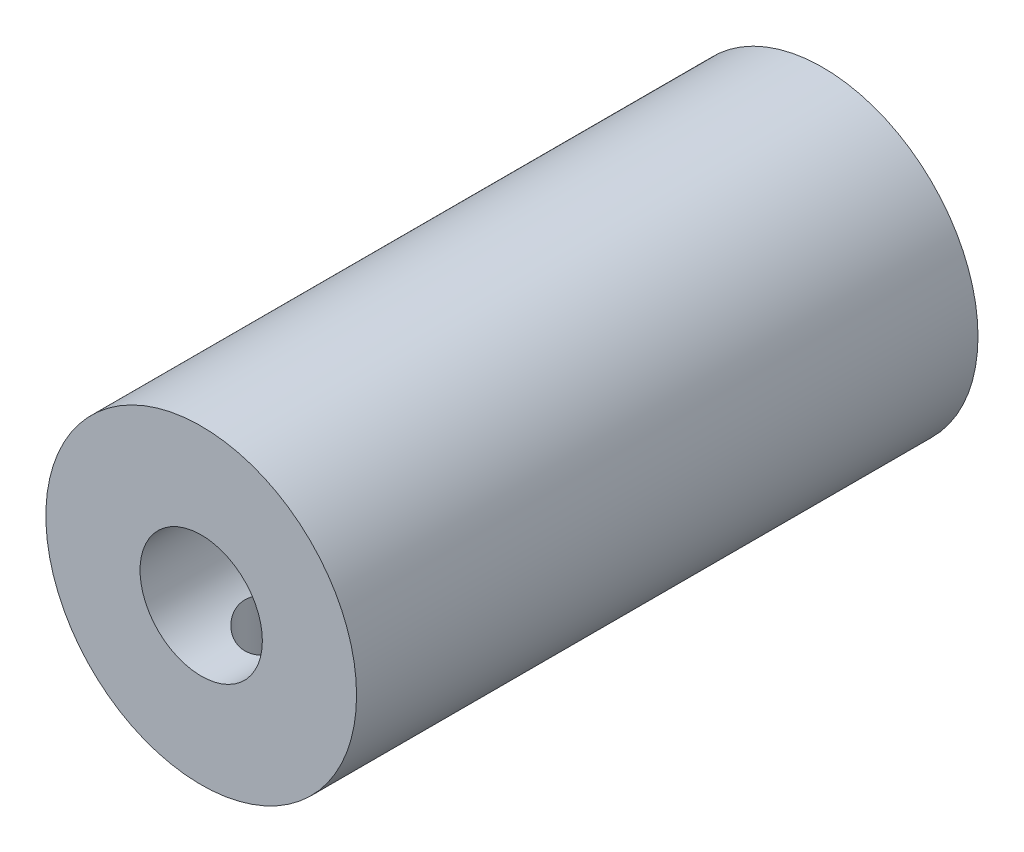
ISO-10303-21;
HEADER;
FILE_DESCRIPTION(('STEP AP214'),'2;1');
FILE_NAME('part.step','',(''),(''),'','','');
FILE_SCHEMA(('AUTOMOTIVE_DESIGN { 1 0 10303 214 1 1 1 1 }'));
ENDSEC;
DATA;
#1=APPLICATION_CONTEXT('core data for automotive mechanical design processes');
#2=APPLICATION_PROTOCOL_DEFINITION('international standard','automotive_design',2000,#1);
#3=PRODUCT_CONTEXT('',#1,'mechanical');
#4=PRODUCT('Part','Part','',(#3));
#5=PRODUCT_RELATED_PRODUCT_CATEGORY('part','',(#4));
#6=PRODUCT_DEFINITION_FORMATION('','',#4);
#7=PRODUCT_DEFINITION_CONTEXT('part definition',#1,'design');
#8=PRODUCT_DEFINITION('design','',#6,#7);
#9=PRODUCT_DEFINITION_SHAPE('','',#8);
#10=(LENGTH_UNIT() NAMED_UNIT(*) SI_UNIT(.MILLI.,.METRE.));
#11=(NAMED_UNIT(*) PLANE_ANGLE_UNIT() SI_UNIT($,.RADIAN.));
#12=(NAMED_UNIT(*) SI_UNIT($,.STERADIAN.) SOLID_ANGLE_UNIT());
#13=UNCERTAINTY_MEASURE_WITH_UNIT(LENGTH_MEASURE(1.E-05),#10,'distance_accuracy_value','');
#14=(GEOMETRIC_REPRESENTATION_CONTEXT(3) GLOBAL_UNCERTAINTY_ASSIGNED_CONTEXT((#13)) GLOBAL_UNIT_ASSIGNED_CONTEXT((#10,
#11,#12)) REPRESENTATION_CONTEXT('',''));
#15=CARTESIAN_POINT('',(0.,0.,0.));
#16=DIRECTION('',(0.,0.,1.));
#17=DIRECTION('',(1.,0.,0.));
#18=AXIS2_PLACEMENT_3D('',#15,#16,#17);
#19=CARTESIAN_POINT('',(0.,0.,25.4));
#20=DIRECTION('',(0.,0.,-1.));
#21=DIRECTION('',(-1.,0.,0.));
#22=AXIS2_PLACEMENT_3D('',#19,#20,#21);
#23=CYLINDRICAL_SURFACE('',#22,6.35);
#24=CARTESIAN_POINT('',(0.,-6.35,23.6140625));
#25=CARTESIAN_POINT('',(-0.0770408471682805,-6.34999857899858,23.6140598693034));
#26=CARTESIAN_POINT('',(-0.15411348315526,-6.34858371582944,23.6076315480876));
#27=CARTESIAN_POINT('',(-0.306069518531246,-6.3430762080525,23.5821148143666));
#28=CARTESIAN_POINT('',(-0.380951313826294,-6.33898165026606,23.5630173565476));
#29=CARTESIAN_POINT('',(-0.526307623730002,-6.32857064766496,23.5127891374238));
#30=CARTESIAN_POINT('',(-0.596786653438423,-6.32225652460999,23.4816709469655));
#31=CARTESIAN_POINT('',(-0.731520840225308,-6.30808785716228,23.4083244870091));
#32=CARTESIAN_POINT('',(-0.795776158099902,-6.30023335258277,23.3660965046489));
#33=CARTESIAN_POINT('',(-0.917272723348732,-6.28370341003478,23.2710119171915));
#34=CARTESIAN_POINT('',(-0.974399782936218,-6.27501778865132,23.218011163738));
#35=CARTESIAN_POINT('',(-1.07902809540525,-6.25787628862363,23.1031949885077));
#36=CARTESIAN_POINT('',(-1.12652848987194,-6.24942043052567,23.0413787814889));
#37=CARTESIAN_POINT('',(-1.21105894182183,-6.23359544573771,22.9098421298178));
#38=CARTESIAN_POINT('',(-1.24796743339354,-6.22623936751427,22.8400418522263));
#39=CARTESIAN_POINT('',(-1.30948659380819,-6.21359298291537,22.6950422066535));
#40=CARTESIAN_POINT('',(-1.33409873341495,-6.20830242949952,22.61984348561));
#41=CARTESIAN_POINT('',(-1.36994915689751,-6.20048981569181,22.467420223313));
#42=CARTESIAN_POINT('',(-1.38138961213298,-6.19792595162784,22.3902454219172));
#43=CARTESIAN_POINT('',(-1.39120053912365,-6.19573145355588,22.2350325548732));
#44=CARTESIAN_POINT('',(-1.3895726177385,-6.19610045892848,22.1569945965354));
#45=CARTESIAN_POINT('',(-1.37345569747506,-6.19969216119694,22.0037736715116));
#46=CARTESIAN_POINT('',(-1.35920156493733,-6.20286274198083,21.9285645930165));
#47=CARTESIAN_POINT('',(-1.31860894659745,-6.21161795094662,21.7816317978724));
#48=CARTESIAN_POINT('',(-1.29226978268468,-6.21720271459119,21.7099082770534));
#49=CARTESIAN_POINT('',(-1.22803912268214,-6.23020838169099,21.5713223209075));
#50=CARTESIAN_POINT('',(-1.19005732002183,-6.23764354992541,21.5045031345282));
#51=CARTESIAN_POINT('',(-1.10368304558917,-6.25350352055307,21.3780997711631));
#52=CARTESIAN_POINT('',(-1.05528915442123,-6.26192845780233,21.3185165823363));
#53=CARTESIAN_POINT('',(-0.948221191319583,-6.27904229219529,21.2069243751887));
#54=CARTESIAN_POINT('',(-0.889347407317585,-6.28773295721028,21.1551070541177));
#55=CARTESIAN_POINT('',(-0.763647218737204,-6.30423308338503,21.062050075938));
#56=CARTESIAN_POINT('',(-0.69682067007699,-6.31204252857457,21.0208106105132));
#57=CARTESIAN_POINT('',(-0.556877893735644,-6.32592565886696,20.9500325873793));
#58=CARTESIAN_POINT('',(-0.483748565062281,-6.33199560926044,20.9205191538667));
#59=CARTESIAN_POINT('',(-0.333406298546851,-6.3416880672381,20.8742527118445));
#60=CARTESIAN_POINT('',(-0.256193956405841,-6.34531093078939,20.8574978473559));
#61=CARTESIAN_POINT('',(-0.101521759768154,-6.34965034804132,20.8375029862832));
#62=CARTESIAN_POINT('',(-0.0240972914376585,-6.35042320588568,20.8340011288717));
#63=CARTESIAN_POINT('',(0.130230356866134,-6.34913331284916,20.8399019189039));
#64=CARTESIAN_POINT('',(0.20713357184841,-6.34707075433855,20.8493036908942));
#65=CARTESIAN_POINT('',(0.357368057618589,-6.34037731419124,20.8805277277516));
#66=CARTESIAN_POINT('',(0.43072925302515,-6.33577484832666,20.9022126419359));
#67=CARTESIAN_POINT('',(0.572772984759522,-6.32451674628277,20.9572349508315));
#68=CARTESIAN_POINT('',(0.641455121837127,-6.31786093516479,20.9905733384149));
#69=CARTESIAN_POINT('',(0.773273856447656,-6.30309556357787,21.0685018158413));
#70=CARTESIAN_POINT('',(0.836317293289703,-6.29496660673028,21.1132457334331));
#71=CARTESIAN_POINT('',(0.954094899266633,-6.27819624848666,21.2125125908739));
#72=CARTESIAN_POINT('',(1.00882798728205,-6.26955478061946,21.2670368010628));
#73=CARTESIAN_POINT('',(1.10946652714324,-6.2525388718201,21.3855181122511));
#74=CARTESIAN_POINT('',(1.15519065365343,-6.24417228961642,21.4496305695928));
#75=CARTESIAN_POINT('',(1.23522363853578,-6.22883534751375,21.5847783780868));
#76=CARTESIAN_POINT('',(1.26953299083004,-6.22186492720743,21.6558134295235));
#77=CARTESIAN_POINT('',(1.3255308249353,-6.21017608603567,21.8024091155417));
#78=CARTESIAN_POINT('',(1.34729026638093,-6.2054450311924,21.8779415872971));
#79=CARTESIAN_POINT('',(1.3777784494499,-6.19874782905592,22.0317075911832));
#80=CARTESIAN_POINT('',(1.38650927531006,-6.19678123952368,22.1099406892354));
#81=CARTESIAN_POINT('',(1.3906036744485,-6.19586350318036,22.2650589152149));
#82=CARTESIAN_POINT('',(1.38625475155462,-6.1968474986074,22.3419362101337));
#83=CARTESIAN_POINT('',(1.36495585245806,-6.20157337782062,22.4938340945831));
#84=CARTESIAN_POINT('',(1.34800602480797,-6.20531522909432,22.5688547059914));
#85=CARTESIAN_POINT('',(1.30212537285487,-6.21510358904485,22.7146812276129));
#86=CARTESIAN_POINT('',(1.27323639800581,-6.22114204176945,22.7855008812921));
#87=CARTESIAN_POINT('',(1.20433345118798,-6.23484638338867,22.9213309126718));
#88=CARTESIAN_POINT('',(1.16431831990124,-6.24251244185608,22.9863406840637));
#89=CARTESIAN_POINT('',(1.07334538224577,-6.25880195994543,23.1101228078034));
#90=CARTESIAN_POINT('',(1.0221826878529,-6.2674416430782,23.1687424725145));
#91=CARTESIAN_POINT('',(0.910782131259336,-6.28459592080665,23.2766586209977));
#92=CARTESIAN_POINT('',(0.850542173914804,-6.29311048602432,23.3259529464271));
#93=CARTESIAN_POINT('',(0.72175512179688,-6.30918620130407,23.414431465789));
#94=CARTESIAN_POINT('',(0.653110375924714,-6.31673354607912,23.4534761694948));
#95=CARTESIAN_POINT('',(0.510081834303294,-6.3298859198831,23.5194115434239));
#96=CARTESIAN_POINT('',(0.435702912410398,-6.3354925766542,23.5463124050221));
#97=CARTESIAN_POINT('',(0.301041738185887,-6.34313167188264,23.5824030162648));
#98=CARTESIAN_POINT('',(0.241487886914349,-6.34569133939321,23.5942526660688));
#99=CARTESIAN_POINT('',(0.121295893746687,-6.34912602552347,23.61008326917));
#100=CARTESIAN_POINT('',(0.060657800034914,-6.35000111881973,23.6140645712684));
#101=CARTESIAN_POINT('',(0.,-6.35,23.6140625));
#102=B_SPLINE_CURVE_WITH_KNOTS('',3,(#24,#25,#26,#27,#28,#29,#30,#31,#32,#33,#34,#35,#36,#37,
#38,#39,#40,#41,#42,#43,#44,#45,#46,#47,#48,#49,#50,#51,#52,#53,#54,#55,#56,#57,#58,#59,#60,#61,
#62,#63,#64,#65,#66,#67,#68,#69,#70,#71,#72,#73,#74,#75,#76,#77,#78,#79,#80,#81,#82,#83,#84,#85,
#86,#87,#88,#89,#90,#91,#92,#93,#94,#95,#96,#97,#98,#99,#100,#101),.UNSPECIFIED.,.T.,.F.,(4,2,2,
2,2,2,2,2,2,2,2,2,2,2,2,2,2,2,2,2,2,2,2,2,2,2,2,2,2,2,2,2,2,2,2,2,2,2,4),(0.,0.230900509144249,
0.461966050731101,0.692790603672132,0.923609191426884,1.15774795204596,1.39190758176553,
1.62865607320933,1.86537624043712,2.09841242042368,2.33141994721876,2.56018212935158,
2.78895714926963,3.01955360668713,3.25018151938972,3.48579772155466,3.72141819307559,
3.95754081719481,4.19362908617659,4.42502746626468,4.65641014778622,4.88525517593931,
5.11411970636798,5.34625135018098,5.57841316690403,5.81485460555446,6.05128581195316,
6.28636674309187,6.5214100634136,6.75132496959777,6.98123716534877,7.21035021078304,
7.43948713818204,7.67325690109677,7.90708070382926,8.14393862784678,8.38059740434398,
8.56240404777389,8.74420263159577),.UNSPECIFIED.);
#103=CARTESIAN_POINT('',(0.,-6.35,23.6140625));
#104=VERTEX_POINT('',#103);
#105=EDGE_CURVE('E68',#104,#104,#102,.T.);
#106=ORIENTED_EDGE('',*,*,#105,.F.);
#107=EDGE_LOOP('',(#106));
#108=FACE_BOUND('',#107,.T.);
#109=CARTESIAN_POINT('',(0.,-6.35,4.5640625));
#110=CARTESIAN_POINT('',(-0.0770408471682832,-6.34999857899858,4.56405986930336));
#111=CARTESIAN_POINT('',(-0.154113483155263,-6.34858371582944,4.55763154808764));
#112=CARTESIAN_POINT('',(-0.306069518531249,-6.3430762080525,4.53211481436661));
#113=CARTESIAN_POINT('',(-0.380951313826296,-6.33898165026606,4.51301735654758));
#114=CARTESIAN_POINT('',(-0.526307623730005,-6.32857064766495,4.46278913742385));
#115=CARTESIAN_POINT('',(-0.596786653438426,-6.32225652460999,4.43167094696553));
#116=CARTESIAN_POINT('',(-0.731520840225311,-6.30808785716228,4.35832448700909));
#117=CARTESIAN_POINT('',(-0.795776158099905,-6.30023335258277,4.31609650464893));
#118=CARTESIAN_POINT('',(-0.917272723348735,-6.28370341003478,4.22101191719148));
#119=CARTESIAN_POINT('',(-0.974399782936221,-6.27501778865132,4.16801116373797));
#120=CARTESIAN_POINT('',(-1.07902809540525,-6.25787628862363,4.05319498850772));
#121=CARTESIAN_POINT('',(-1.12652848987194,-6.24942043052566,3.99137878148886));
#122=CARTESIAN_POINT('',(-1.21105894182183,-6.2335954457377,3.85984212981785));
#123=CARTESIAN_POINT('',(-1.24796743339354,-6.22623936751426,3.79004185222628));
#124=CARTESIAN_POINT('',(-1.30948659380819,-6.21359298291537,3.64504220665348));
#125=CARTESIAN_POINT('',(-1.33409873341496,-6.20830242949951,3.56984348560998));
#126=CARTESIAN_POINT('',(-1.36994915689751,-6.20048981569181,3.41742022331296));
#127=CARTESIAN_POINT('',(-1.38138961213299,-6.19792595162784,3.34024542191716));
#128=CARTESIAN_POINT('',(-1.39120053912366,-6.19573145355588,3.18503255487326));
#129=CARTESIAN_POINT('',(-1.3895726177385,-6.19610045892848,3.1069945965354));
#130=CARTESIAN_POINT('',(-1.37345569747506,-6.19969216119694,2.95377367151164));
#131=CARTESIAN_POINT('',(-1.35920156493734,-6.20286274198083,2.87856459301655));
#132=CARTESIAN_POINT('',(-1.31860894659746,-6.21161795094662,2.7316317978724));
#133=CARTESIAN_POINT('',(-1.29226978268469,-6.21720271459119,2.65990827705339));
#134=CARTESIAN_POINT('',(-1.22803912268215,-6.23020838169099,2.52132232090749));
#135=CARTESIAN_POINT('',(-1.19005732002183,-6.23764354992541,2.45450313452819));
#136=CARTESIAN_POINT('',(-1.10368304558917,-6.25350352055306,2.32809977116307));
#137=CARTESIAN_POINT('',(-1.05528915442124,-6.26192845780233,2.26851658233634));
#138=CARTESIAN_POINT('',(-0.948221191319587,-6.27904229219529,2.15692437518868));
#139=CARTESIAN_POINT('',(-0.889347407317589,-6.28773295721028,2.10510705411768));
#140=CARTESIAN_POINT('',(-0.763647218737209,-6.30423308338503,2.01205007593804));
#141=CARTESIAN_POINT('',(-0.696820670076995,-6.31204252857457,1.97081061051325));
#142=CARTESIAN_POINT('',(-0.55687789373565,-6.32592565886695,1.90003258737933));
#143=CARTESIAN_POINT('',(-0.483748565062286,-6.33199560926044,1.87051915386669));
#144=CARTESIAN_POINT('',(-0.333406298546856,-6.3416880672381,1.82425271184448));
#145=CARTESIAN_POINT('',(-0.256193956405845,-6.34531093078939,1.80749784735592));
#146=CARTESIAN_POINT('',(-0.101521759768157,-6.34965034804132,1.78750298628319));
#147=CARTESIAN_POINT('',(-0.0240972914376622,-6.35042320588568,1.78400112887168));
#148=CARTESIAN_POINT('',(0.13023035686613,-6.34913331284916,1.7899019189039));
#149=CARTESIAN_POINT('',(0.207133571848407,-6.34707075433855,1.79930369089422));
#150=CARTESIAN_POINT('',(0.357368057618586,-6.34037731419124,1.83052772775156));
#151=CARTESIAN_POINT('',(0.430729253025147,-6.33577484832666,1.85221264193585));
#152=CARTESIAN_POINT('',(0.572772984759519,-6.32451674628277,1.90723495083147));
#153=CARTESIAN_POINT('',(0.641455121837125,-6.31786093516479,1.9405733384149));
#154=CARTESIAN_POINT('',(0.773273856447655,-6.30309556357787,2.0185018158413));
#155=CARTESIAN_POINT('',(0.836317293289701,-6.29496660673028,2.06324573343311));
#156=CARTESIAN_POINT('',(0.954094899266632,-6.27819624848666,2.16251259087393));
#157=CARTESIAN_POINT('',(1.00882798728205,-6.26955478061946,2.21703680106277));
#158=CARTESIAN_POINT('',(1.10946652714324,-6.2525388718201,2.33551811225114));
#159=CARTESIAN_POINT('',(1.15519065365343,-6.24417228961643,2.39963056959285));
#160=CARTESIAN_POINT('',(1.23522363853578,-6.22883534751375,2.53477837808682));
#161=CARTESIAN_POINT('',(1.26953299083004,-6.22186492720743,2.6058134295235));
#162=CARTESIAN_POINT('',(1.3255308249353,-6.21017608603567,2.75240911554171));
#163=CARTESIAN_POINT('',(1.34729026638093,-6.2054450311924,2.82794158729707));
#164=CARTESIAN_POINT('',(1.3777784494499,-6.19874782905592,2.98170759118322));
#165=CARTESIAN_POINT('',(1.38650927531006,-6.19678123952368,3.05994068923544));
#166=CARTESIAN_POINT('',(1.39060367444849,-6.19586350318036,3.21505891521493));
#167=CARTESIAN_POINT('',(1.38625475155461,-6.1968474986074,3.29193621013374));
#168=CARTESIAN_POINT('',(1.36495585245806,-6.20157337782062,3.44383409458313));
#169=CARTESIAN_POINT('',(1.34800602480797,-6.20531522909432,3.51885470599145));
#170=CARTESIAN_POINT('',(1.30212537285486,-6.21510358904485,3.66468122761294));
#171=CARTESIAN_POINT('',(1.2732363980058,-6.22114204176945,3.73550088129206));
#172=CARTESIAN_POINT('',(1.20433345118798,-6.23484638338867,3.87133091267178));
#173=CARTESIAN_POINT('',(1.16431831990124,-6.24251244185608,3.93634068406372));
#174=CARTESIAN_POINT('',(1.07334538224577,-6.25880195994543,4.06012280780342));
#175=CARTESIAN_POINT('',(1.0221826878529,-6.2674416430782,4.11874247251448));
#176=CARTESIAN_POINT('',(0.910782131259334,-6.28459592080665,4.22665862099773));
#177=CARTESIAN_POINT('',(0.850542173914802,-6.29311048602432,4.27595294642711));
#178=CARTESIAN_POINT('',(0.721755121796878,-6.30918620130407,4.36443146578896));
#179=CARTESIAN_POINT('',(0.653110375924712,-6.31673354607912,4.40347616949484));
#180=CARTESIAN_POINT('',(0.510081834303291,-6.3298859198831,4.46941154342387));
#181=CARTESIAN_POINT('',(0.435702912410396,-6.3354925766542,4.4963124050221));
#182=CARTESIAN_POINT('',(0.301041738185885,-6.34313167188264,4.53240301626477));
#183=CARTESIAN_POINT('',(0.241487886914347,-6.34569133939321,4.54425266606876));
#184=CARTESIAN_POINT('',(0.121295893746684,-6.34912602552347,4.56008326916996));
#185=CARTESIAN_POINT('',(0.0606578000349114,-6.35000111881973,4.56406457126838));
#186=CARTESIAN_POINT('',(0.,-6.35,4.5640625));
#187=B_SPLINE_CURVE_WITH_KNOTS('',3,(#109,#110,#111,#112,#113,#114,#115,#116,#117,#118,#119,
#120,#121,#122,#123,#124,#125,#126,#127,#128,#129,#130,#131,#132,#133,#134,#135,#136,#137,#138,
#139,#140,#141,#142,#143,#144,#145,#146,#147,#148,#149,#150,#151,#152,#153,#154,#155,#156,#157,
#158,#159,#160,#161,#162,#163,#164,#165,#166,#167,#168,#169,#170,#171,#172,#173,#174,#175,#176,
#177,#178,#179,#180,#181,#182,#183,#184,#185,#186),.UNSPECIFIED.,.T.,.F.,(4,2,2,2,2,2,2,2,2,2,2,
2,2,2,2,2,2,2,2,2,2,2,2,2,2,2,2,2,2,2,2,2,2,2,2,2,2,2,4),(0.,0.230900509144249,0.4619660507311,
0.692790603672132,0.923609191426884,1.15774795204596,1.39190758176554,1.62865607320934,
1.86537624043712,2.09841242042367,2.33141994721875,2.56018212935158,2.78895714926963,
3.01955360668713,3.25018151938973,3.48579772155466,3.72141819307559,3.95754081719481,
4.19362908617659,4.42502746626468,4.65641014778622,4.88525517593931,5.11411970636798,
5.34625135018098,5.57841316690403,5.81485460555446,6.05128581195316,6.28636674309187,
6.5214100634136,6.75132496959778,6.98123716534877,7.21035021078304,7.43948713818205,
7.67325690109677,7.90708070382926,8.14393862784679,8.38059740434398,8.5624040477739,
8.74420263159577),.UNSPECIFIED.);
#188=CARTESIAN_POINT('',(0.,-6.35,4.5640625));
#189=VERTEX_POINT('',#188);
#190=EDGE_CURVE('E83',#189,#189,#187,.T.);
#191=ORIENTED_EDGE('',*,*,#190,.F.);
#192=EDGE_LOOP('',(#191));
#193=FACE_BOUND('',#192,.T.);
#194=CARTESIAN_POINT('',(0.,0.,25.4));
#195=DIRECTION('',(0.,0.,1.));
#196=DIRECTION('',(1.,0.,0.));
#197=AXIS2_PLACEMENT_3D('',#194,#195,#196);
#198=CIRCLE('',#197,6.35);
#199=CARTESIAN_POINT('',(6.35,0.,25.4));
#200=VERTEX_POINT('',#199);
#201=EDGE_CURVE('E10',#200,#200,#198,.T.);
#202=ORIENTED_EDGE('',*,*,#201,.F.);
#203=EDGE_LOOP('',(#202));
#204=FACE_BOUND('',#203,.T.);
#205=CARTESIAN_POINT('',(0.,0.,0.));
#206=DIRECTION('',(0.,0.,1.));
#207=DIRECTION('',(1.,0.,0.));
#208=AXIS2_PLACEMENT_3D('',#205,#206,#207);
#209=CIRCLE('',#208,6.35);
#210=CARTESIAN_POINT('',(6.35,0.,0.));
#211=VERTEX_POINT('',#210);
#212=EDGE_CURVE('E50',#211,#211,#209,.T.);
#213=ORIENTED_EDGE('',*,*,#212,.T.);
#214=EDGE_LOOP('',(#213));
#215=FACE_BOUND('',#214,.T.);
#216=ADVANCED_FACE('F37',(#108,#193,#204,#215),#23,.T.);
#217=CARTESIAN_POINT('',(0.,0.,25.4));
#218=DIRECTION('',(0.,0.,1.));
#219=DIRECTION('',(1.,0.,0.));
#220=AXIS2_PLACEMENT_3D('',#217,#218,#219);
#221=PLANE('',#220);
#222=CARTESIAN_POINT('',(0.,0.,25.4));
#223=DIRECTION('',(0.,0.,1.));
#224=DIRECTION('',(1.,0.,0.));
#225=AXIS2_PLACEMENT_3D('',#222,#223,#224);
#226=CIRCLE('',#225,2.5);
#227=CARTESIAN_POINT('',(2.5,0.,25.4));
#228=VERTEX_POINT('',#227);
#229=EDGE_CURVE('E56',#228,#228,#226,.T.);
#230=ORIENTED_EDGE('',*,*,#229,.F.);
#231=EDGE_LOOP('',(#230));
#232=FACE_BOUND('',#231,.T.);
#233=ORIENTED_EDGE('',*,*,#201,.T.);
#234=EDGE_LOOP('',(#233));
#235=FACE_BOUND('',#234,.T.);
#236=ADVANCED_FACE('F112',(#232,#235),#221,.T.);
#237=CARTESIAN_POINT('',(0.,0.,0.));
#238=DIRECTION('',(0.,0.,1.));
#239=DIRECTION('',(1.,0.,0.));
#240=AXIS2_PLACEMENT_3D('',#237,#238,#239);
#241=PLANE('',#240);
#242=CARTESIAN_POINT('',(0.,0.,0.));
#243=DIRECTION('',(0.,0.,-1.));
#244=DIRECTION('',(-1.,0.,0.));
#245=AXIS2_PLACEMENT_3D('',#242,#243,#244);
#246=CIRCLE('',#245,3.175);
#247=CARTESIAN_POINT('',(-3.175,0.,0.));
#248=VERTEX_POINT('',#247);
#249=EDGE_CURVE('E99',#248,#248,#246,.T.);
#250=ORIENTED_EDGE('',*,*,#249,.F.);
#251=EDGE_LOOP('',(#250));
#252=FACE_BOUND('',#251,.T.);
#253=ORIENTED_EDGE('',*,*,#212,.F.);
#254=EDGE_LOOP('',(#253));
#255=FACE_BOUND('',#254,.T.);
#256=ADVANCED_FACE('F114',(#252,#255),#241,.F.);
#257=CARTESIAN_POINT('',(0.,0.,12.7));
#258=DIRECTION('',(0.,0.,1.));
#259=DIRECTION('',(1.,0.,0.));
#260=AXIS2_PLACEMENT_3D('',#257,#258,#259);
#261=CYLINDRICAL_SURFACE('',#260,2.5);
#262=CARTESIAN_POINT('',(0.,-2.5,23.6140625));
#263=CARTESIAN_POINT('',(-0.0720955610583357,-2.50000175852872,23.6140645490277));
#264=CARTESIAN_POINT('',(-0.144179305829038,-2.49685472079578,23.6084250190901));
#265=CARTESIAN_POINT('',(-0.286105998965866,-2.4845963286225,23.5861756937233));
#266=CARTESIAN_POINT('',(-0.355948531098324,-2.47548387294453,23.5695638727647));
#267=CARTESIAN_POINT('',(-0.491211534033722,-2.45222551761888,23.526243824579));
#268=CARTESIAN_POINT('',(-0.55664722236417,-2.43809812119472,23.4995726900844));
#269=CARTESIAN_POINT('',(-0.681993896379685,-2.40604970706999,23.4371413459378));
#270=CARTESIAN_POINT('',(-0.741903549406163,-2.38812777769606,23.4013789516073));
#271=CARTESIAN_POINT('',(-0.85916683873521,-2.34860009345852,23.3189900830453));
#272=CARTESIAN_POINT('',(-0.916052916695233,-2.32682482138057,23.2717810061882));
#273=CARTESIAN_POINT('',(-1.02154839442349,-2.28248111120209,23.1691182094203));
#274=CARTESIAN_POINT('',(-1.07014933841577,-2.25991189079792,23.1136561733846));
#275=CARTESIAN_POINT('',(-1.16266930702794,-2.21384997947769,22.9893881229803));
#276=CARTESIAN_POINT('',(-1.20561421532919,-2.1904956182129,22.9197993371759));
#277=CARTESIAN_POINT('',(-1.27900345453513,-2.14847603399563,22.7730416066483));
#278=CARTESIAN_POINT('',(-1.30946568594348,-2.12980411132283,22.695883714564));
#279=CARTESIAN_POINT('',(-1.35143021788565,-2.10335853992222,22.5528134341582));
#280=CARTESIAN_POINT('',(-1.36557189276607,-2.0941191040569,22.4879461862983));
#281=CARTESIAN_POINT('',(-1.38443540976415,-2.08169935749641,22.3563105453975));
#282=CARTESIAN_POINT('',(-1.38916654064617,-2.07851307212282,22.2895440930946));
#283=CARTESIAN_POINT('',(-1.3889548280543,-2.07865443234663,22.1559632288846));
#284=CARTESIAN_POINT('',(-1.38400138062561,-2.08198921807425,22.0891488445699));
#285=CARTESIAN_POINT('',(-1.36468307774289,-2.0947001097852,21.9574750638361));
#286=CARTESIAN_POINT('',(-1.35031210102426,-2.104080145032,21.8926169676783));
#287=CARTESIAN_POINT('',(-1.31283801134811,-2.12766080598391,21.7664279156269));
#288=CARTESIAN_POINT('',(-1.28973310110541,-2.14186242382197,21.7050976886998));
#289=CARTESIAN_POINT('',(-1.23557860709366,-2.1735518990217,21.5869820653199));
#290=CARTESIAN_POINT('',(-1.20452592056158,-2.19104103910209,21.5301984552304));
#291=CARTESIAN_POINT('',(-1.1298932032373,-2.23055616471866,21.4136271266414));
#292=CARTESIAN_POINT('',(-1.08512645037687,-2.25286767990076,21.3546947445677));
#293=CARTESIAN_POINT('',(-0.986838173840647,-2.29762268988441,21.2446456111097));
#294=CARTESIAN_POINT('',(-0.933309738688411,-2.32006627528291,21.193535091934));
#295=CARTESIAN_POINT('',(-0.812481234081124,-2.36525670326192,21.0953892862752));
#296=CARTESIAN_POINT('',(-0.744335003583058,-2.38780339421602,21.0492932132667));
#297=CARTESIAN_POINT('',(-0.599872273372215,-2.42811882434038,20.9694344183919));
#298=CARTESIAN_POINT('',(-0.523561194020508,-2.44589070615963,20.9356635791207));
#299=CARTESIAN_POINT('',(-0.370551735771621,-2.47351931219905,20.8840177840124));
#300=CARTESIAN_POINT('',(-0.294264469947764,-2.48384791036383,20.8651855178669));
#301=CARTESIAN_POINT('',(-0.139006913315673,-2.49734431061447,20.8406835726525));
#302=CARTESIAN_POINT('',(-0.0600390560666809,-2.50051844022225,20.8350022625559));
#303=CARTESIAN_POINT('',(0.0886700270391578,-2.49940720469181,20.8370063223536));
#304=CARTESIAN_POINT('',(0.158442236720611,-2.49592679193222,20.8432492143574));
#305=CARTESIAN_POINT('',(0.295764921287917,-2.48340005593318,20.8660073877098));
#306=CARTESIAN_POINT('',(0.363315324036589,-2.47435355216254,20.882523002245));
#307=CARTESIAN_POINT('',(0.494214609567671,-2.45156183754914,20.9250120577407));
#308=CARTESIAN_POINT('',(0.557578076566211,-2.43783408860324,20.950950373459));
#309=CARTESIAN_POINT('',(0.679124414985624,-2.40680903041146,21.0113708961974));
#310=CARTESIAN_POINT('',(0.737305895029135,-2.38951076658414,21.0458553885438));
#311=CARTESIAN_POINT('',(0.853284384540511,-2.35074854312217,21.1264156499349));
#312=CARTESIAN_POINT('',(0.910423211048078,-2.32903896932896,21.1733199582189));
#313=CARTESIAN_POINT('',(1.01645879004524,-2.28475835783455,21.2754043775568));
#314=CARTESIAN_POINT('',(1.06534635613964,-2.26218639383563,21.3305935850226));
#315=CARTESIAN_POINT('',(1.15847656348327,-2.21605387955359,21.4542801633193));
#316=CARTESIAN_POINT('',(1.20175473835225,-2.19262290968774,21.5235581684073));
#317=CARTESIAN_POINT('',(1.2758760518161,-2.15034216425003,21.669730153459));
#318=CARTESIAN_POINT('',(1.30673677466684,-2.13148592557909,21.7466131703081));
#319=CARTESIAN_POINT('',(1.3495205037564,-2.10458900608484,21.8893992803115));
#320=CARTESIAN_POINT('',(1.36405006114847,-2.0951131883408,21.954250721081));
#321=CARTESIAN_POINT('',(1.38368129334264,-2.08220322187422,22.0859311016451));
#322=CARTESIAN_POINT('',(1.38879239111794,-2.07876303479392,22.1527579969324));
#323=CARTESIAN_POINT('',(1.38931202945525,-2.07841579567325,22.2865483996856));
#324=CARTESIAN_POINT('',(1.38470846125849,-2.08151689696137,22.3535119735851));
#325=CARTESIAN_POINT('',(1.36603961140716,-2.09381363295552,22.4855427313152));
#326=CARTESIAN_POINT('',(1.35196828761642,-2.10301315950169,22.5506086764331));
#327=CARTESIAN_POINT('',(1.31509825570686,-2.12626054834052,22.6770381466955));
#328=CARTESIAN_POINT('',(1.2923264273161,-2.14029346511573,22.7384124078032));
#329=CARTESIAN_POINT('',(1.23883656890987,-2.17169144762113,22.8566606929487));
#330=CARTESIAN_POINT('',(1.20811547842358,-2.18905779605824,22.9135329726836));
#331=CARTESIAN_POINT('',(1.13424055433436,-2.22833979877806,23.030267683111));
#332=CARTESIAN_POINT('',(1.08991075847173,-2.25054662677195,23.0892889587602));
#333=CARTESIAN_POINT('',(0.992514924715278,-2.29516599987642,23.1995916239254));
#334=CARTESIAN_POINT('',(0.939441828651964,-2.31757869726144,23.2508666955539));
#335=CARTESIAN_POINT('',(0.81942338984715,-2.36285208340014,23.3495820742491));
#336=CARTESIAN_POINT('',(0.751608809748966,-2.38551610712334,23.3960660838189));
#337=CARTESIAN_POINT('',(0.607756654403464,-2.42614946277392,23.4767636811836));
#338=CARTESIAN_POINT('',(0.531725114252456,-2.44412220760406,23.5109861960012));
#339=CARTESIAN_POINT('',(0.38067150091981,-2.47193154652946,23.5630503113406));
#340=CARTESIAN_POINT('',(0.306171880007829,-2.48235382666159,23.5820869308786));
#341=CARTESIAN_POINT('',(0.154442193493438,-2.49638443725474,23.6075869929682));
#342=CARTESIAN_POINT('',(0.0772143198680954,-2.49999811661638,23.614060305492));
#343=CARTESIAN_POINT('',(0.,-2.5,23.6140625));
#344=B_SPLINE_CURVE_WITH_KNOTS('',3,(#262,#263,#264,#265,#266,#267,#268,#269,#270,#271,#272,
#273,#274,#275,#276,#277,#278,#279,#280,#281,#282,#283,#284,#285,#286,#287,#288,#289,#290,#291,
#292,#293,#294,#295,#296,#297,#298,#299,#300,#301,#302,#303,#304,#305,#306,#307,#308,#309,#310,
#311,#312,#313,#314,#315,#316,#317,#318,#319,#320,#321,#322,#323,#324,#325,#326,#327,#328,#329,
#330,#331,#332,#333,#334,#335,#336,#337,#338,#339,#340,#341,#342,#343),.UNSPECIFIED.,.T.,.F.,(4,
2,2,2,2,2,2,2,2,2,2,2,2,2,2,2,2,2,2,2,2,2,2,2,2,2,2,2,2,2,2,2,2,2,2,2,2,2,2,2,4),(0.,
0.215987227460274,0.432014338188072,0.647252536868254,0.862542507416137,1.09280574231232,
1.32330259402735,1.57716638371111,1.83066484084544,2.03088033918238,2.23089811469852,
2.43113501873353,2.63150220326906,2.83191064220419,3.03239743901789,3.26335868419862,
3.49450300437534,3.74909285796376,4.00351473467915,4.23989691457434,4.4760699522703,
4.68546574779414,4.89486833524093,5.10349820562336,5.31218392586564,5.54238678884929,
5.77284427730003,6.02652439415272,6.27984400151049,6.48036223150746,6.68067973803338,
6.88124707599794,7.08194253366662,7.28202290288785,7.48218041808671,7.71250412406066,
7.94301468194224,8.19754426153427,8.45188815162999,8.68339234209212,8.91471458473401),.UNSPECIFIED.);
#345=CARTESIAN_POINT('',(0.,-2.5,23.6140625));
#346=VERTEX_POINT('',#345);
#347=EDGE_CURVE('E40',#346,#346,#344,.T.);
#348=ORIENTED_EDGE('',*,*,#347,.T.);
#349=EDGE_LOOP('',(#348));
#350=FACE_BOUND('',#349,.T.);
#351=CARTESIAN_POINT('',(0.,0.,12.7));
#352=DIRECTION('',(0.,0.,1.));
#353=DIRECTION('',(1.,0.,0.));
#354=AXIS2_PLACEMENT_3D('',#351,#352,#353);
#355=CIRCLE('',#354,2.5);
#356=CARTESIAN_POINT('',(2.5,0.,12.7));
#357=VERTEX_POINT('',#356);
#358=EDGE_CURVE('E98',#357,#357,#355,.T.);
#359=ORIENTED_EDGE('',*,*,#358,.F.);
#360=EDGE_LOOP('',(#359));
#361=FACE_BOUND('',#360,.T.);
#362=ORIENTED_EDGE('',*,*,#229,.T.);
#363=EDGE_LOOP('',(#362));
#364=FACE_BOUND('',#363,.T.);
#365=ADVANCED_FACE('F110',(#350,#361,#364),#261,.F.);
#366=CARTESIAN_POINT('',(0.,0.,12.7));
#367=DIRECTION('',(0.,0.,-1.));
#368=DIRECTION('',(-1.,0.,0.));
#369=AXIS2_PLACEMENT_3D('',#366,#367,#368);
#370=PLANE('',#369);
#371=CARTESIAN_POINT('',(0.,0.,12.7));
#372=DIRECTION('',(0.,0.,-1.));
#373=DIRECTION('',(-1.,0.,0.));
#374=AXIS2_PLACEMENT_3D('',#371,#372,#373);
#375=CIRCLE('',#374,3.175);
#376=CARTESIAN_POINT('',(-3.175,0.,12.7));
#377=VERTEX_POINT('',#376);
#378=EDGE_CURVE('E94',#377,#377,#375,.T.);
#379=ORIENTED_EDGE('',*,*,#378,.T.);
#380=EDGE_LOOP('',(#379));
#381=FACE_BOUND('',#380,.T.);
#382=ORIENTED_EDGE('',*,*,#358,.T.);
#383=EDGE_LOOP('',(#382));
#384=FACE_BOUND('',#383,.T.);
#385=ADVANCED_FACE('F124',(#381,#384),#370,.T.);
#386=CARTESIAN_POINT('',(0.,0.,12.7));
#387=DIRECTION('',(0.,0.,-1.));
#388=DIRECTION('',(-1.,0.,0.));
#389=AXIS2_PLACEMENT_3D('',#386,#387,#388);
#390=CYLINDRICAL_SURFACE('',#389,3.175);
#391=CARTESIAN_POINT('',(0.,-3.175,4.5640625));
#392=CARTESIAN_POINT('',(-0.0740848869632378,-3.17499329211694,4.56405374035316));
#393=CARTESIAN_POINT('',(-0.148268819588762,-3.17237760551348,4.55810108213316));
#394=CARTESIAN_POINT('',(-0.294519510570093,-3.16216568014389,4.53451028649877));
#395=CARTESIAN_POINT('',(-0.366580610434771,-3.15455720242491,4.51684343267259));
#396=CARTESIAN_POINT('',(-0.50622470637591,-3.13517339172844,4.47061547244362));
#397=CARTESIAN_POINT('',(-0.573822508907864,-3.12341275277265,4.44209275626923));
#398=CARTESIAN_POINT('',(-0.70320226957361,-3.09685313480019,4.37512961482449));
#399=CARTESIAN_POINT('',(-0.76498565779778,-3.08205490576068,4.33669163701956));
#400=CARTESIAN_POINT('',(-0.884435250211301,-3.04998551381007,4.24879534221706));
#401=CARTESIAN_POINT('',(-0.941745610659669,-3.03262813527589,4.19888523725037));
#402=CARTESIAN_POINT('',(-1.04749434303101,-2.99774701173009,4.09041951630068));
#403=CARTESIAN_POINT('',(-1.09592758846961,-2.98022317669592,4.0318589397481));
#404=CARTESIAN_POINT('',(-1.18521461759802,-2.94589674042641,3.90382267339619));
#405=CARTESIAN_POINT('',(-1.22549829649303,-2.92918819859534,3.83392148808252));
#406=CARTESIAN_POINT('',(-1.29357746430872,-2.89977031043167,3.68750321587912));
#407=CARTESIAN_POINT('',(-1.3213800284053,-2.88705869958428,3.61098990661846));
#408=CARTESIAN_POINT('',(-1.36220083562944,-2.86801684428565,3.45761300333912));
#409=CARTESIAN_POINT('',(-1.37590719037762,-2.86139147877589,3.38097069810307));
#410=CARTESIAN_POINT('',(-1.3902881422547,-2.85443421597404,3.22620999370874));
#411=CARTESIAN_POINT('',(-1.39097103491811,-2.85409831249552,3.14809256590523));
#412=CARTESIAN_POINT('',(-1.37980012902833,-2.85951081693555,2.99979596045457));
#413=CARTESIAN_POINT('',(-1.36902147338627,-2.86473746939156,2.92951275417919));
#414=CARTESIAN_POINT('',(-1.33705080688025,-2.879796700264,2.79187661077388));
#415=CARTESIAN_POINT('',(-1.31585654916921,-2.88963027246084,2.72452430931089));
#416=CARTESIAN_POINT('',(-1.26323685032138,-2.91302234378802,2.59287784633509));
#417=CARTESIAN_POINT('',(-1.23159479026903,-2.92665866585697,2.52868472518269));
#418=CARTESIAN_POINT('',(-1.15913271960809,-2.9561061578828,2.40625326456597));
#419=CARTESIAN_POINT('',(-1.11830890020955,-2.97191822932729,2.34801741093027));
#420=CARTESIAN_POINT('',(-1.02414040600872,-3.0057427097333,2.23338608310891));
#421=CARTESIAN_POINT('',(-0.969979090267929,-3.02382217108774,2.17767923280976));
#422=CARTESIAN_POINT('',(-0.852923925491533,-3.05890128100996,2.07589449578679));
#423=CARTESIAN_POINT('',(-0.790027603653972,-3.0759006218121,2.02981934499652));
#424=CARTESIAN_POINT('',(-0.655011680000087,-3.10749364646487,1.94745133371743));
#425=CARTESIAN_POINT('',(-0.582684213589342,-3.12200727653378,1.91146617235963));
#426=CARTESIAN_POINT('',(-0.432204208115034,-3.14636583867873,1.85242091072453));
#427=CARTESIAN_POINT('',(-0.354055259184007,-3.15621362106625,1.82935291793029));
#428=CARTESIAN_POINT('',(-0.199881179912605,-3.16958149861979,1.79830184287316));
#429=CARTESIAN_POINT('',(-0.124075362154006,-3.17348772710061,1.78939633170427));
#430=CARTESIAN_POINT('',(0.028043252125259,-3.17578607691123,1.78413894628798));
#431=CARTESIAN_POINT('',(0.104355875413433,-3.17417999444489,1.78778298273233));
#432=CARTESIAN_POINT('',(0.250818778029721,-3.16588054361543,1.80688638651885));
#433=CARTESIAN_POINT('',(0.321075056136259,-3.15947660390743,1.82167381876447));
#434=CARTESIAN_POINT('',(0.45801767572948,-3.14254803238049,1.86168165461834));
#435=CARTESIAN_POINT('',(0.524703577533293,-3.13202289436704,1.8869033398563));
#436=CARTESIAN_POINT('',(0.654975243964012,-3.10743719840338,1.94787471960945));
#437=CARTESIAN_POINT('',(0.718399030391751,-3.09327644655316,1.98392875425421));
#438=CARTESIAN_POINT('',(0.838525275667979,-3.0628982350672,2.06520940177303));
#439=CARTESIAN_POINT('',(0.895224812028738,-3.04667988745304,2.11043997996667));
#440=CARTESIAN_POINT('',(1.00497116938474,-3.01234429924955,2.21292102798752));
#441=CARTESIAN_POINT('',(1.05738416214292,-2.99417781857974,2.27083543118948));
#442=CARTESIAN_POINT('',(1.15195130583396,-2.95908488342215,2.3948797631396));
#443=CARTESIAN_POINT('',(1.19410217517907,-2.94215882679933,2.46101230967409));
#444=CARTESIAN_POINT('',(1.26768593101705,-2.9112248335702,2.6015171656906));
#445=CARTESIAN_POINT('',(1.29887544043192,-2.89728555786874,2.67603321925041));
#446=CARTESIAN_POINT('',(1.34797408827494,-2.87477538659776,2.83006743073655));
#447=CARTESIAN_POINT('',(1.36589570091999,-2.86619944970303,2.90958081375329));
#448=CARTESIAN_POINT('',(1.38665269895733,-2.85621074705766,3.06425312824311));
#449=CARTESIAN_POINT('',(1.39061561454655,-2.85426306967656,3.13922656119859));
#450=CARTESIAN_POINT('',(1.38641506700068,-2.85630613079324,3.28874209039402));
#451=CARTESIAN_POINT('',(1.37825398190338,-2.86029570474104,3.36328426834285));
#452=CARTESIAN_POINT('',(1.35101470513305,-2.87325418127476,3.50545252282007));
#453=CARTESIAN_POINT('',(1.33257966291298,-2.88192888732732,3.57323136603529));
#454=CARTESIAN_POINT('',(1.28598143333956,-2.9030203591415,3.70473215838052));
#455=CARTESIAN_POINT('',(1.25781545475271,-2.91543819845751,3.76845293727269));
#456=CARTESIAN_POINT('',(1.19051451890192,-2.9435877253265,3.89443629787028));
#457=CARTESIAN_POINT('',(1.15079876971167,-2.95947926100615,3.95635213589568));
#458=CARTESIAN_POINT('',(1.06229486425888,-2.99238738449914,4.07299151152607));
#459=CARTESIAN_POINT('',(1.01350307246918,-3.00940442138017,4.12771215195577));
#460=CARTESIAN_POINT('',(0.90340087838031,-3.04435473521783,4.23313215089847));
#461=CARTESIAN_POINT('',(0.841384654443671,-3.06224555900851,4.28311207457616));
#462=CARTESIAN_POINT('',(0.709208233762176,-3.09552690285497,4.37202137222115));
#463=CARTESIAN_POINT('',(0.639044357047671,-3.11091628552016,4.41094572526393));
#464=CARTESIAN_POINT('',(0.49331929510505,-3.13730373637721,4.47592874535588));
#465=CARTESIAN_POINT('',(0.417838927244656,-3.14835562317577,4.50214610533035));
#466=CARTESIAN_POINT('',(0.263076426273624,-3.16503130811166,4.5412407948599));
#467=CARTESIAN_POINT('',(0.183806763826367,-3.17067177667615,4.5541591025468));
#468=CARTESIAN_POINT('',(0.0694305723718943,-3.17443306361275,4.56276476402882));
#469=CARTESIAN_POINT('',(0.0347261669631453,-3.17500314421843,4.56406660595158));
#470=CARTESIAN_POINT('',(0.,-3.175,4.5640625));
#471=B_SPLINE_CURVE_WITH_KNOTS('',3,(#391,#392,#393,#394,#395,#396,#397,#398,#399,#400,#401,
#402,#403,#404,#405,#406,#407,#408,#409,#410,#411,#412,#413,#414,#415,#416,#417,#418,#419,#420,
#421,#422,#423,#424,#425,#426,#427,#428,#429,#430,#431,#432,#433,#434,#435,#436,#437,#438,#439,
#440,#441,#442,#443,#444,#445,#446,#447,#448,#449,#450,#451,#452,#453,#454,#455,#456,#457,#458,
#459,#460,#461,#462,#463,#464,#465,#466,#467,#468,#469,#470),.UNSPECIFIED.,.T.,.F.,(4,2,2,2,2,2,
2,2,2,2,2,2,2,2,2,2,2,2,2,2,2,2,2,2,2,2,2,2,2,2,2,2,2,2,2,2,2,2,2,4),(0.,0.222148641975848,
0.444843886935759,0.666758810719258,0.888619009749953,1.12147555639611,1.35446615559094,
1.60039237546669,1.8461790104377,2.07929818046498,2.31226885597183,2.52516581984358,
2.73810872988633,2.95577741439878,3.17353655961451,3.41178304236628,3.65009710856691,
3.89503906144285,4.13983118861455,4.36790936363049,4.59591322571249,4.81117034414913,
5.02645391027358,5.24846437577743,5.47057098038442,5.71007211204953,5.94964973029294,
6.19425293204265,6.43862586957636,6.66273935003856,6.88680887801531,7.09821316510673,
7.30967814207407,7.53450925126414,7.75943061417806,8.0031693227932,8.24701854980631,
8.48773850348666,8.72771449068989,8.83184329682166),.UNSPECIFIED.);
#472=CARTESIAN_POINT('',(0.,-3.175,4.5640625));
#473=VERTEX_POINT('',#472);
#474=EDGE_CURVE('E60',#473,#473,#471,.T.);
#475=ORIENTED_EDGE('',*,*,#474,.T.);
#476=EDGE_LOOP('',(#475));
#477=FACE_BOUND('',#476,.T.);
#478=ORIENTED_EDGE('',*,*,#378,.F.);
#479=EDGE_LOOP('',(#478));
#480=FACE_BOUND('',#479,.T.);
#481=ORIENTED_EDGE('',*,*,#249,.T.);
#482=EDGE_LOOP('',(#481));
#483=FACE_BOUND('',#482,.T.);
#484=ADVANCED_FACE('F69',(#477,#480,#483),#390,.F.);
#485=CARTESIAN_POINT('',(0.,-6.351,3.175));
#486=DIRECTION('',(0.,1.,0.));
#487=DIRECTION('',(0.,0.,1.));
#488=AXIS2_PLACEMENT_3D('',#485,#486,#487);
#489=CYLINDRICAL_SURFACE('',#488,1.3890625);
#490=ORIENTED_EDGE('',*,*,#190,.T.);
#491=EDGE_LOOP('',(#490));
#492=FACE_BOUND('',#491,.T.);
#493=ORIENTED_EDGE('',*,*,#474,.F.);
#494=EDGE_LOOP('',(#493));
#495=FACE_BOUND('',#494,.T.);
#496=ADVANCED_FACE('F72',(#492,#495),#489,.F.);
#497=CARTESIAN_POINT('',(0.,-6.351,22.225));
#498=DIRECTION('',(0.,1.,0.));
#499=DIRECTION('',(0.,0.,1.));
#500=AXIS2_PLACEMENT_3D('',#497,#498,#499);
#501=CYLINDRICAL_SURFACE('',#500,1.3890625);
#502=ORIENTED_EDGE('',*,*,#105,.T.);
#503=EDGE_LOOP('',(#502));
#504=FACE_BOUND('',#503,.T.);
#505=ORIENTED_EDGE('',*,*,#347,.F.);
#506=EDGE_LOOP('',(#505));
#507=FACE_BOUND('',#506,.T.);
#508=ADVANCED_FACE('F77',(#504,#507),#501,.F.);
#509=CLOSED_SHELL('',(#216,#236,#256,#365,#385,#484,#496,#508));
#510=MANIFOLD_SOLID_BREP('B2',#509);
#511=ADVANCED_BREP_SHAPE_REPRESENTATION('',(#18,#510),#14);
#512=SHAPE_DEFINITION_REPRESENTATION(#9,#511);
ENDSEC;
END-ISO-10303-21;
